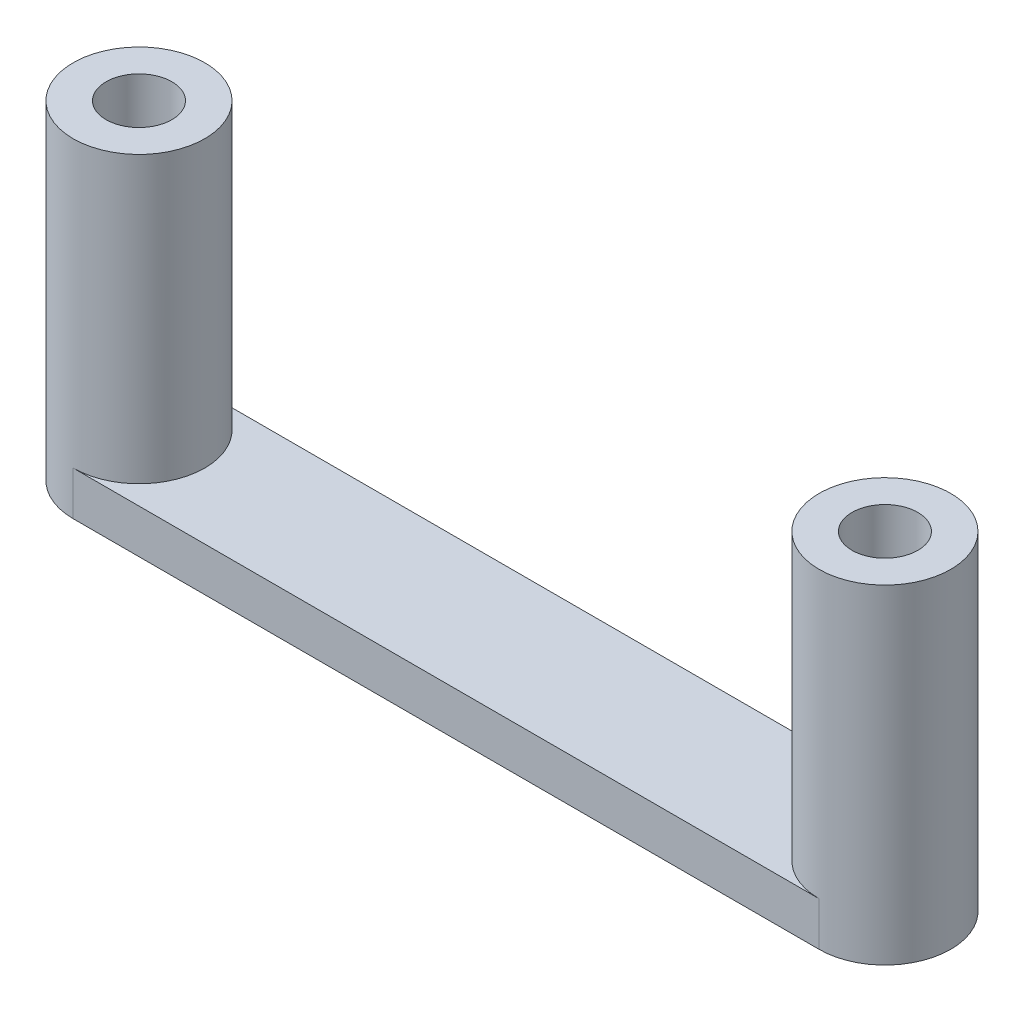
ISO-10303-21;
HEADER;
FILE_DESCRIPTION(('STEP AP214'),'2;1');
FILE_NAME('part.step','',(''),(''),'','','');
FILE_SCHEMA(('AUTOMOTIVE_DESIGN { 1 0 10303 214 1 1 1 1 }'));
ENDSEC;
DATA;
#1=APPLICATION_CONTEXT('core data for automotive mechanical design processes');
#2=APPLICATION_PROTOCOL_DEFINITION('international standard','automotive_design',2000,#1);
#3=PRODUCT_CONTEXT('',#1,'mechanical');
#4=PRODUCT('Part','Part','',(#3));
#5=PRODUCT_RELATED_PRODUCT_CATEGORY('part','',(#4));
#6=PRODUCT_DEFINITION_FORMATION('','',#4);
#7=PRODUCT_DEFINITION_CONTEXT('part definition',#1,'design');
#8=PRODUCT_DEFINITION('design','',#6,#7);
#9=PRODUCT_DEFINITION_SHAPE('','',#8);
#10=(LENGTH_UNIT() NAMED_UNIT(*) SI_UNIT(.MILLI.,.METRE.));
#11=(NAMED_UNIT(*) PLANE_ANGLE_UNIT() SI_UNIT($,.RADIAN.));
#12=(NAMED_UNIT(*) SI_UNIT($,.STERADIAN.) SOLID_ANGLE_UNIT());
#13=UNCERTAINTY_MEASURE_WITH_UNIT(LENGTH_MEASURE(1.E-05),#10,'distance_accuracy_value','');
#14=(GEOMETRIC_REPRESENTATION_CONTEXT(3) GLOBAL_UNCERTAINTY_ASSIGNED_CONTEXT((#13)) GLOBAL_UNIT_ASSIGNED_CONTEXT((#10,
#11,#12)) REPRESENTATION_CONTEXT('',''));
#15=CARTESIAN_POINT('',(0.,0.,0.));
#16=DIRECTION('',(0.,0.,1.));
#17=DIRECTION('',(1.,0.,0.));
#18=AXIS2_PLACEMENT_3D('',#15,#16,#17);
#19=CARTESIAN_POINT('',(-15.918812674748,2.,0.));
#20=DIRECTION('',(0.,1.,0.));
#21=DIRECTION('',(0.,0.,1.));
#22=AXIS2_PLACEMENT_3D('',#19,#20,#21);
#23=PLANE('',#22);
#24=DIRECTION('',(1.,0.,0.));
#25=VECTOR('',#24,1.);
#26=CARTESIAN_POINT('',(-15.918812674748,2.,3.));
#27=LINE('',#26,#25);
#28=CARTESIAN_POINT('',(-15.918812674748,2.,3.));
#29=VERTEX_POINT('',#28);
#30=CARTESIAN_POINT('',(18.081187325252,2.,3.));
#31=VERTEX_POINT('',#30);
#32=EDGE_CURVE('E88',#29,#31,#27,.T.);
#33=ORIENTED_EDGE('',*,*,#32,.T.);
#34=CARTESIAN_POINT('',(18.081187325252,2.,0.));
#35=DIRECTION('',(0.,1.,0.));
#36=DIRECTION('',(0.,0.,1.));
#37=AXIS2_PLACEMENT_3D('',#34,#35,#36);
#38=CIRCLE('',#37,3.);
#39=CARTESIAN_POINT('',(18.081187325252,2.,-3.));
#40=VERTEX_POINT('',#39);
#41=EDGE_CURVE('E11',#31,#40,#38,.F.);
#42=ORIENTED_EDGE('',*,*,#41,.T.);
#43=DIRECTION('',(-1.,0.,0.));
#44=VECTOR('',#43,1.);
#45=CARTESIAN_POINT('',(-15.918812674748,2.,-3.));
#46=LINE('',#45,#44);
#47=CARTESIAN_POINT('',(-15.918812674748,2.,-3.));
#48=VERTEX_POINT('',#47);
#49=EDGE_CURVE('E57',#40,#48,#46,.T.);
#50=ORIENTED_EDGE('',*,*,#49,.T.);
#51=CARTESIAN_POINT('',(-15.918812674748,2.,0.));
#52=DIRECTION('',(0.,1.,0.));
#53=DIRECTION('',(0.,0.,1.));
#54=AXIS2_PLACEMENT_3D('',#51,#52,#53);
#55=CIRCLE('',#54,3.);
#56=EDGE_CURVE('E95',#29,#48,#55,.T.);
#57=ORIENTED_EDGE('',*,*,#56,.F.);
#58=EDGE_LOOP('',(#33,#42,#50,#57));
#59=FACE_BOUND('',#58,.T.);
#60=ADVANCED_FACE('F41',(#59),#23,.T.);
#61=CARTESIAN_POINT('',(-15.918812674748,2.,0.));
#62=DIRECTION('',(0.,-1.,0.));
#63=DIRECTION('',(0.,0.,-1.));
#64=AXIS2_PLACEMENT_3D('',#61,#62,#63);
#65=CYLINDRICAL_SURFACE('',#64,3.);
#66=CARTESIAN_POINT('',(-15.918812674748,0.,0.));
#67=DIRECTION('',(0.,1.,0.));
#68=DIRECTION('',(0.,0.,1.));
#69=AXIS2_PLACEMENT_3D('',#66,#67,#68);
#70=CIRCLE('',#69,3.);
#71=CARTESIAN_POINT('',(-15.918812674748,0.,-3.));
#72=VERTEX_POINT('',#71);
#73=CARTESIAN_POINT('',(-15.918812674748,0.,3.));
#74=VERTEX_POINT('',#73);
#75=EDGE_CURVE('E94',#72,#74,#70,.T.);
#76=ORIENTED_EDGE('',*,*,#75,.T.);
#77=DIRECTION('',(0.,-1.,0.));
#78=VECTOR('',#77,1.);
#79=CARTESIAN_POINT('',(-15.918812674748,2.,3.));
#80=LINE('',#79,#78);
#81=EDGE_CURVE('E50',#29,#74,#80,.T.);
#82=ORIENTED_EDGE('',*,*,#81,.F.);
#83=ORIENTED_EDGE('',*,*,#56,.T.);
#84=DIRECTION('',(0.,-1.,0.));
#85=VECTOR('',#84,1.);
#86=CARTESIAN_POINT('',(-15.918812674748,2.,-3.));
#87=LINE('',#86,#85);
#88=EDGE_CURVE('E83',#48,#72,#87,.T.);
#89=ORIENTED_EDGE('',*,*,#88,.T.);
#90=EDGE_LOOP('',(#76,#82,#83,#89));
#91=FACE_BOUND('',#90,.T.);
#92=CARTESIAN_POINT('',(-15.918812674748,15.,0.));
#93=DIRECTION('',(0.,1.,0.));
#94=DIRECTION('',(0.,0.,1.));
#95=AXIS2_PLACEMENT_3D('',#92,#93,#94);
#96=CIRCLE('',#95,3.);
#97=CARTESIAN_POINT('',(-15.918812674748,15.,3.));
#98=VERTEX_POINT('',#97);
#99=EDGE_CURVE('E100',#98,#98,#96,.T.);
#100=ORIENTED_EDGE('',*,*,#99,.F.);
#101=EDGE_LOOP('',(#100));
#102=FACE_BOUND('',#101,.T.);
#103=ADVANCED_FACE('F43',(#91,#102),#65,.T.);
#104=CARTESIAN_POINT('',(-15.918812674748,2.,3.));
#105=DIRECTION('',(0.,0.,-1.));
#106=DIRECTION('',(-1.,0.,0.));
#107=AXIS2_PLACEMENT_3D('',#104,#105,#106);
#108=PLANE('',#107);
#109=DIRECTION('',(1.,0.,0.));
#110=VECTOR('',#109,1.);
#111=CARTESIAN_POINT('',(-15.918812674748,0.,3.));
#112=LINE('',#111,#110);
#113=CARTESIAN_POINT('',(18.081187325252,0.,3.));
#114=VERTEX_POINT('',#113);
#115=EDGE_CURVE('E98',#74,#114,#112,.T.);
#116=ORIENTED_EDGE('',*,*,#115,.T.);
#117=DIRECTION('',(0.,-1.,0.));
#118=VECTOR('',#117,1.);
#119=CARTESIAN_POINT('',(18.081187325252,2.,3.));
#120=LINE('',#119,#118);
#121=EDGE_CURVE('E110',#31,#114,#120,.T.);
#122=ORIENTED_EDGE('',*,*,#121,.F.);
#123=ORIENTED_EDGE('',*,*,#32,.F.);
#124=ORIENTED_EDGE('',*,*,#81,.T.);
#125=EDGE_LOOP('',(#116,#122,#123,#124));
#126=FACE_BOUND('',#125,.T.);
#127=ADVANCED_FACE('F113',(#126),#108,.F.);
#128=CARTESIAN_POINT('',(18.081187325252,2.,0.));
#129=DIRECTION('',(0.,-1.,0.));
#130=DIRECTION('',(0.,0.,-1.));
#131=AXIS2_PLACEMENT_3D('',#128,#129,#130);
#132=CYLINDRICAL_SURFACE('',#131,3.);
#133=CARTESIAN_POINT('',(18.081187325252,0.,0.));
#134=DIRECTION('',(0.,1.,0.));
#135=DIRECTION('',(0.,0.,1.));
#136=AXIS2_PLACEMENT_3D('',#133,#134,#135);
#137=CIRCLE('',#136,3.);
#138=CARTESIAN_POINT('',(18.081187325252,0.,-3.));
#139=VERTEX_POINT('',#138);
#140=EDGE_CURVE('E75',#114,#139,#137,.T.);
#141=ORIENTED_EDGE('',*,*,#140,.T.);
#142=DIRECTION('',(0.,-1.,0.));
#143=VECTOR('',#142,1.);
#144=CARTESIAN_POINT('',(18.081187325252,2.,-3.));
#145=LINE('',#144,#143);
#146=EDGE_CURVE('E85',#40,#139,#145,.T.);
#147=ORIENTED_EDGE('',*,*,#146,.F.);
#148=ORIENTED_EDGE('',*,*,#41,.F.);
#149=ORIENTED_EDGE('',*,*,#121,.T.);
#150=EDGE_LOOP('',(#141,#147,#148,#149));
#151=FACE_BOUND('',#150,.T.);
#152=CARTESIAN_POINT('',(18.081187325252,15.,0.));
#153=DIRECTION('',(0.,1.,0.));
#154=DIRECTION('',(0.,0.,1.));
#155=AXIS2_PLACEMENT_3D('',#152,#153,#154);
#156=CIRCLE('',#155,3.);
#157=CARTESIAN_POINT('',(18.081187325252,15.,3.));
#158=VERTEX_POINT('',#157);
#159=EDGE_CURVE('E121',#158,#158,#156,.T.);
#160=ORIENTED_EDGE('',*,*,#159,.F.);
#161=EDGE_LOOP('',(#160));
#162=FACE_BOUND('',#161,.T.);
#163=ADVANCED_FACE('F118',(#151,#162),#132,.T.);
#164=CARTESIAN_POINT('',(-15.918812674748,2.,-3.));
#165=DIRECTION('',(0.,0.,1.));
#166=DIRECTION('',(1.,0.,0.));
#167=AXIS2_PLACEMENT_3D('',#164,#165,#166);
#168=PLANE('',#167);
#169=DIRECTION('',(-1.,0.,0.));
#170=VECTOR('',#169,1.);
#171=CARTESIAN_POINT('',(-15.918812674748,0.,-3.));
#172=LINE('',#171,#170);
#173=EDGE_CURVE('E80',#139,#72,#172,.T.);
#174=ORIENTED_EDGE('',*,*,#173,.T.);
#175=ORIENTED_EDGE('',*,*,#88,.F.);
#176=ORIENTED_EDGE('',*,*,#49,.F.);
#177=ORIENTED_EDGE('',*,*,#146,.T.);
#178=EDGE_LOOP('',(#174,#175,#176,#177));
#179=FACE_BOUND('',#178,.T.);
#180=ADVANCED_FACE('F82',(#179),#168,.F.);
#181=CARTESIAN_POINT('',(-15.918812674748,0.,0.));
#182=DIRECTION('',(0.,1.,0.));
#183=DIRECTION('',(0.,0.,1.));
#184=AXIS2_PLACEMENT_3D('',#181,#182,#183);
#185=PLANE('',#184);
#186=CARTESIAN_POINT('',(18.081187325252,0.,0.));
#187=DIRECTION('',(0.,1.,0.));
#188=DIRECTION('',(0.,0.,1.));
#189=AXIS2_PLACEMENT_3D('',#186,#187,#188);
#190=CIRCLE('',#189,1.5);
#191=CARTESIAN_POINT('',(18.081187325252,0.,1.5));
#192=VERTEX_POINT('',#191);
#193=EDGE_CURVE('E129',#192,#192,#190,.T.);
#194=ORIENTED_EDGE('',*,*,#193,.T.);
#195=EDGE_LOOP('',(#194));
#196=FACE_BOUND('',#195,.T.);
#197=CARTESIAN_POINT('',(-15.918812674748,0.,0.));
#198=DIRECTION('',(0.,1.,0.));
#199=DIRECTION('',(0.,0.,1.));
#200=AXIS2_PLACEMENT_3D('',#197,#198,#199);
#201=CIRCLE('',#200,1.5);
#202=CARTESIAN_POINT('',(-15.918812674748,0.,1.5));
#203=VERTEX_POINT('',#202);
#204=EDGE_CURVE('E125',#203,#203,#201,.T.);
#205=ORIENTED_EDGE('',*,*,#204,.T.);
#206=EDGE_LOOP('',(#205));
#207=FACE_BOUND('',#206,.T.);
#208=ORIENTED_EDGE('',*,*,#75,.F.);
#209=ORIENTED_EDGE('',*,*,#173,.F.);
#210=ORIENTED_EDGE('',*,*,#140,.F.);
#211=ORIENTED_EDGE('',*,*,#115,.F.);
#212=EDGE_LOOP('',(#208,#209,#210,#211));
#213=FACE_BOUND('',#212,.T.);
#214=ADVANCED_FACE('F97',(#196,#207,#213),#185,.F.);
#215=CARTESIAN_POINT('',(0.,15.,0.));
#216=DIRECTION('',(0.,1.,0.));
#217=DIRECTION('',(0.,0.,1.));
#218=AXIS2_PLACEMENT_3D('',#215,#216,#217);
#219=PLANE('',#218);
#220=CARTESIAN_POINT('',(-15.918812674748,15.,0.));
#221=DIRECTION('',(0.,1.,0.));
#222=DIRECTION('',(0.,0.,1.));
#223=AXIS2_PLACEMENT_3D('',#220,#221,#222);
#224=CIRCLE('',#223,1.5);
#225=CARTESIAN_POINT('',(-15.918812674748,15.,1.5));
#226=VERTEX_POINT('',#225);
#227=EDGE_CURVE('E126',#226,#226,#224,.T.);
#228=ORIENTED_EDGE('',*,*,#227,.F.);
#229=EDGE_LOOP('',(#228));
#230=FACE_BOUND('',#229,.T.);
#231=ORIENTED_EDGE('',*,*,#99,.T.);
#232=EDGE_LOOP('',(#231));
#233=FACE_BOUND('',#232,.T.);
#234=ADVANCED_FACE('F150',(#230,#233),#219,.T.);
#235=CARTESIAN_POINT('',(0.,15.,0.));
#236=DIRECTION('',(0.,1.,0.));
#237=DIRECTION('',(0.,0.,1.));
#238=AXIS2_PLACEMENT_3D('',#235,#236,#237);
#239=PLANE('',#238);
#240=CARTESIAN_POINT('',(18.081187325252,15.,0.));
#241=DIRECTION('',(0.,1.,0.));
#242=DIRECTION('',(0.,0.,1.));
#243=AXIS2_PLACEMENT_3D('',#240,#241,#242);
#244=CIRCLE('',#243,1.5);
#245=CARTESIAN_POINT('',(18.081187325252,15.,1.5));
#246=VERTEX_POINT('',#245);
#247=EDGE_CURVE('E132',#246,#246,#244,.T.);
#248=ORIENTED_EDGE('',*,*,#247,.F.);
#249=EDGE_LOOP('',(#248));
#250=FACE_BOUND('',#249,.T.);
#251=ORIENTED_EDGE('',*,*,#159,.T.);
#252=EDGE_LOOP('',(#251));
#253=FACE_BOUND('',#252,.T.);
#254=ADVANCED_FACE('F147',(#250,#253),#239,.T.);
#255=CARTESIAN_POINT('',(-15.918812674748,0.,0.));
#256=DIRECTION('',(0.,1.,0.));
#257=DIRECTION('',(0.,0.,1.));
#258=AXIS2_PLACEMENT_3D('',#255,#256,#257);
#259=CYLINDRICAL_SURFACE('',#258,1.5);
#260=ORIENTED_EDGE('',*,*,#204,.F.);
#261=EDGE_LOOP('',(#260));
#262=FACE_BOUND('',#261,.T.);
#263=ORIENTED_EDGE('',*,*,#227,.T.);
#264=EDGE_LOOP('',(#263));
#265=FACE_BOUND('',#264,.T.);
#266=ADVANCED_FACE('F143',(#262,#265),#259,.F.);
#267=CARTESIAN_POINT('',(18.081187325252,0.,0.));
#268=DIRECTION('',(0.,1.,0.));
#269=DIRECTION('',(0.,0.,1.));
#270=AXIS2_PLACEMENT_3D('',#267,#268,#269);
#271=CYLINDRICAL_SURFACE('',#270,1.5);
#272=ORIENTED_EDGE('',*,*,#193,.F.);
#273=EDGE_LOOP('',(#272));
#274=FACE_BOUND('',#273,.T.);
#275=ORIENTED_EDGE('',*,*,#247,.T.);
#276=EDGE_LOOP('',(#275));
#277=FACE_BOUND('',#276,.T.);
#278=ADVANCED_FACE('F140',(#274,#277),#271,.F.);
#279=CLOSED_SHELL('',(#60,#103,#127,#163,#180,#214,#234,#254,#266,#278));
#280=MANIFOLD_SOLID_BREP('B2',#279);
#281=ADVANCED_BREP_SHAPE_REPRESENTATION('',(#18,#280),#14);
#282=SHAPE_DEFINITION_REPRESENTATION(#9,#281);
ENDSEC;
END-ISO-10303-21;
